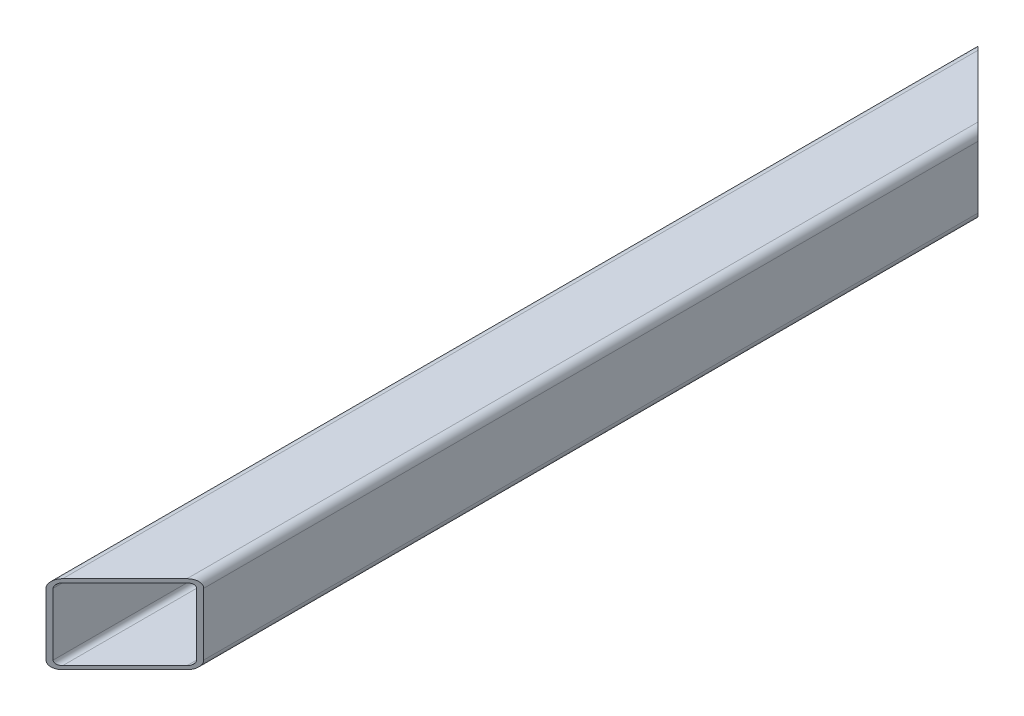
ISO-10303-21;
HEADER;
FILE_DESCRIPTION(('STEP AP214'),'2;1');
FILE_NAME('part.step','',(''),(''),'','','');
FILE_SCHEMA(('AUTOMOTIVE_DESIGN { 1 0 10303 214 1 1 1 1 }'));
ENDSEC;
DATA;
#1=APPLICATION_CONTEXT('core data for automotive mechanical design processes');
#2=APPLICATION_PROTOCOL_DEFINITION('international standard','automotive_design',2000,#1);
#3=PRODUCT_CONTEXT('',#1,'mechanical');
#4=PRODUCT('Part','Part','',(#3));
#5=PRODUCT_RELATED_PRODUCT_CATEGORY('part','',(#4));
#6=PRODUCT_DEFINITION_FORMATION('','',#4);
#7=PRODUCT_DEFINITION_CONTEXT('part definition',#1,'design');
#8=PRODUCT_DEFINITION('design','',#6,#7);
#9=PRODUCT_DEFINITION_SHAPE('','',#8);
#10=(LENGTH_UNIT() NAMED_UNIT(*) SI_UNIT(.MILLI.,.METRE.));
#11=(NAMED_UNIT(*) PLANE_ANGLE_UNIT() SI_UNIT($,.RADIAN.));
#12=(NAMED_UNIT(*) SI_UNIT($,.STERADIAN.) SOLID_ANGLE_UNIT());
#13=UNCERTAINTY_MEASURE_WITH_UNIT(LENGTH_MEASURE(1.E-05),#10,'distance_accuracy_value','');
#14=(GEOMETRIC_REPRESENTATION_CONTEXT(3) GLOBAL_UNCERTAINTY_ASSIGNED_CONTEXT((#13)) GLOBAL_UNIT_ASSIGNED_CONTEXT((#10,
#11,#12)) REPRESENTATION_CONTEXT('',''));
#15=CARTESIAN_POINT('',(0.,0.,0.));
#16=DIRECTION('',(0.,0.,1.));
#17=DIRECTION('',(1.,0.,0.));
#18=AXIS2_PLACEMENT_3D('',#15,#16,#17);
#19=CARTESIAN_POINT('',(28.,2.,390.));
#20=DIRECTION('',(0.,0.,-1.));
#21=DIRECTION('',(-1.,0.,0.));
#22=AXIS2_PLACEMENT_3D('',#19,#20,#21);
#23=CYLINDRICAL_SURFACE('',#22,3.5);
#24=DIRECTION('',(0.,0.,-1.));
#25=VECTOR('',#24,1.);
#26=CARTESIAN_POINT('',(31.5,2.00000000000001,390.));
#27=LINE('',#26,#25);
#28=CARTESIAN_POINT('',(31.5,2.00000000000001,357.));
#29=VERTEX_POINT('',#28);
#30=CARTESIAN_POINT('',(31.5,2.00000000000001,33.));
#31=VERTEX_POINT('',#30);
#32=EDGE_CURVE('E219',#29,#31,#27,.T.);
#33=ORIENTED_EDGE('',*,*,#32,.F.);
#34=CARTESIAN_POINT('',(28.,2.,360.5));
#35=DIRECTION('',(-0.707106781186548,0.,-0.707106781186547));
#36=DIRECTION('',(0.707106781186547,0.,-0.707106781186548));
#37=AXIS2_PLACEMENT_3D('',#34,#35,#36);
#38=ELLIPSE('',#37,4.94974746830584,3.5);
#39=CARTESIAN_POINT('',(28.,-1.5,360.5));
#40=VERTEX_POINT('',#39);
#41=EDGE_CURVE('E201',#29,#40,#38,.T.);
#42=ORIENTED_EDGE('',*,*,#41,.T.);
#43=DIRECTION('',(0.,0.,-1.));
#44=VECTOR('',#43,1.);
#45=CARTESIAN_POINT('',(28.,-1.5,390.));
#46=LINE('',#45,#44);
#47=CARTESIAN_POINT('',(28.,-1.5,29.5000000000001));
#48=VERTEX_POINT('',#47);
#49=EDGE_CURVE('E280',#40,#48,#46,.T.);
#50=ORIENTED_EDGE('',*,*,#49,.T.);
#51=CARTESIAN_POINT('',(28.,2.,29.5));
#52=DIRECTION('',(-0.707106781186547,0.,0.707106781186547));
#53=DIRECTION('',(-0.707106781186548,0.,-0.707106781186548));
#54=AXIS2_PLACEMENT_3D('',#51,#52,#53);
#55=ELLIPSE('',#54,4.94974746830583,3.5);
#56=EDGE_CURVE('E260',#48,#31,#55,.T.);
#57=ORIENTED_EDGE('',*,*,#56,.T.);
#58=EDGE_LOOP('',(#33,#42,#50,#57));
#59=FACE_BOUND('',#58,.T.);
#60=ADVANCED_FACE('F82',(#59),#23,.T.);
#61=CARTESIAN_POINT('',(31.5,2.00000000000001,390.));
#62=DIRECTION('',(-1.,0.,0.));
#63=DIRECTION('',(0.,0.,1.));
#64=AXIS2_PLACEMENT_3D('',#61,#62,#63);
#65=PLANE('',#64);
#66=DIRECTION('',(0.,0.,-1.));
#67=VECTOR('',#66,1.);
#68=CARTESIAN_POINT('',(31.5,28.,390.));
#69=LINE('',#68,#67);
#70=CARTESIAN_POINT('',(31.5,28.,357.));
#71=VERTEX_POINT('',#70);
#72=CARTESIAN_POINT('',(31.5,28.,33.));
#73=VERTEX_POINT('',#72);
#74=EDGE_CURVE('E217',#71,#73,#69,.T.);
#75=ORIENTED_EDGE('',*,*,#74,.F.);
#76=DIRECTION('',(0.,1.,0.));
#77=VECTOR('',#76,1.);
#78=CARTESIAN_POINT('',(31.5,-1.5,357.));
#79=LINE('',#78,#77);
#80=EDGE_CURVE('E197',#29,#71,#79,.T.);
#81=ORIENTED_EDGE('',*,*,#80,.F.);
#82=ORIENTED_EDGE('',*,*,#32,.T.);
#83=DIRECTION('',(0.,1.,0.));
#84=VECTOR('',#83,1.);
#85=CARTESIAN_POINT('',(31.5,-1.5,33.));
#86=LINE('',#85,#84);
#87=EDGE_CURVE('E302',#31,#73,#86,.T.);
#88=ORIENTED_EDGE('',*,*,#87,.T.);
#89=EDGE_LOOP('',(#75,#81,#82,#88));
#90=FACE_BOUND('',#89,.T.);
#91=ADVANCED_FACE('F368',(#90),#65,.F.);
#92=CARTESIAN_POINT('',(28.,28.,390.));
#93=DIRECTION('',(0.,0.,-1.));
#94=DIRECTION('',(-1.,0.,0.));
#95=AXIS2_PLACEMENT_3D('',#92,#93,#94);
#96=CYLINDRICAL_SURFACE('',#95,3.5);
#97=DIRECTION('',(0.,0.,-1.));
#98=VECTOR('',#97,1.);
#99=CARTESIAN_POINT('',(28.,31.5,390.));
#100=LINE('',#99,#98);
#101=CARTESIAN_POINT('',(28.,31.5,360.5));
#102=VERTEX_POINT('',#101);
#103=CARTESIAN_POINT('',(28.,31.5,29.5));
#104=VERTEX_POINT('',#103);
#105=EDGE_CURVE('E208',#102,#104,#100,.T.);
#106=ORIENTED_EDGE('',*,*,#105,.F.);
#107=CARTESIAN_POINT('',(28.,28.,360.5));
#108=DIRECTION('',(-0.707106781186548,0.,-0.707106781186547));
#109=DIRECTION('',(0.707106781186547,0.,-0.707106781186548));
#110=AXIS2_PLACEMENT_3D('',#107,#108,#109);
#111=ELLIPSE('',#110,4.94974746830584,3.5);
#112=EDGE_CURVE('E191',#102,#71,#111,.T.);
#113=ORIENTED_EDGE('',*,*,#112,.T.);
#114=ORIENTED_EDGE('',*,*,#74,.T.);
#115=CARTESIAN_POINT('',(28.,28.,29.5));
#116=DIRECTION('',(-0.707106781186547,0.,0.707106781186547));
#117=DIRECTION('',(-0.707106781186548,0.,-0.707106781186548));
#118=AXIS2_PLACEMENT_3D('',#115,#116,#117);
#119=ELLIPSE('',#118,4.94974746830584,3.5);
#120=EDGE_CURVE('E216',#73,#104,#119,.T.);
#121=ORIENTED_EDGE('',*,*,#120,.T.);
#122=EDGE_LOOP('',(#106,#113,#114,#121));
#123=FACE_BOUND('',#122,.T.);
#124=ADVANCED_FACE('F214',(#123),#96,.T.);
#125=CARTESIAN_POINT('',(2.00000000000001,31.5,390.));
#126=DIRECTION('',(0.,-1.,0.));
#127=DIRECTION('',(0.,0.,-1.));
#128=AXIS2_PLACEMENT_3D('',#125,#126,#127);
#129=PLANE('',#128);
#130=DIRECTION('',(0.,0.,-1.));
#131=VECTOR('',#130,1.);
#132=CARTESIAN_POINT('',(2.00000000000001,31.5,390.));
#133=LINE('',#132,#131);
#134=CARTESIAN_POINT('',(2.,31.5,386.5));
#135=VERTEX_POINT('',#134);
#136=CARTESIAN_POINT('',(1.99999999999998,31.5,3.49999999999996));
#137=VERTEX_POINT('',#136);
#138=EDGE_CURVE('E210',#135,#137,#133,.T.);
#139=ORIENTED_EDGE('',*,*,#138,.F.);
#140=DIRECTION('',(-0.707106781186547,0.,0.707106781186548));
#141=VECTOR('',#140,1.);
#142=CARTESIAN_POINT('',(-1.5,31.5,390.));
#143=LINE('',#142,#141);
#144=EDGE_CURVE('E194',#102,#135,#143,.T.);
#145=ORIENTED_EDGE('',*,*,#144,.F.);
#146=ORIENTED_EDGE('',*,*,#105,.T.);
#147=DIRECTION('',(0.707106781186547,0.,0.707106781186547));
#148=VECTOR('',#147,1.);
#149=CARTESIAN_POINT('',(-1.5,31.5,0.));
#150=LINE('',#149,#148);
#151=EDGE_CURVE('E298',#137,#104,#150,.T.);
#152=ORIENTED_EDGE('',*,*,#151,.F.);
#153=EDGE_LOOP('',(#139,#145,#146,#152));
#154=FACE_BOUND('',#153,.T.);
#155=ADVANCED_FACE('F206',(#154),#129,.F.);
#156=CARTESIAN_POINT('',(2.,28.,390.));
#157=DIRECTION('',(0.,0.,-1.));
#158=DIRECTION('',(-1.,0.,0.));
#159=AXIS2_PLACEMENT_3D('',#156,#157,#158);
#160=CYLINDRICAL_SURFACE('',#159,3.5);
#161=DIRECTION('',(0.,0.,-1.));
#162=VECTOR('',#161,1.);
#163=CARTESIAN_POINT('',(-1.5,28.,390.));
#164=LINE('',#163,#162);
#165=CARTESIAN_POINT('',(-1.5,28.,390.));
#166=VERTEX_POINT('',#165);
#167=CARTESIAN_POINT('',(-1.5,28.,0.));
#168=VERTEX_POINT('',#167);
#169=EDGE_CURVE('E221',#166,#168,#164,.T.);
#170=ORIENTED_EDGE('',*,*,#169,.F.);
#171=CARTESIAN_POINT('',(2.,28.,386.5));
#172=DIRECTION('',(-0.707106781186548,0.,-0.707106781186547));
#173=DIRECTION('',(0.707106781186547,0.,-0.707106781186548));
#174=AXIS2_PLACEMENT_3D('',#171,#172,#173);
#175=ELLIPSE('',#174,4.94974746830584,3.5);
#176=EDGE_CURVE('E202',#166,#135,#175,.T.);
#177=ORIENTED_EDGE('',*,*,#176,.T.);
#178=ORIENTED_EDGE('',*,*,#138,.T.);
#179=CARTESIAN_POINT('',(2.,28.,3.5));
#180=DIRECTION('',(-0.707106781186547,0.,0.707106781186547));
#181=DIRECTION('',(-0.707106781186548,0.,-0.707106781186548));
#182=AXIS2_PLACEMENT_3D('',#179,#180,#181);
#183=ELLIPSE('',#182,4.94974746830583,3.5);
#184=EDGE_CURVE('E251',#137,#168,#183,.T.);
#185=ORIENTED_EDGE('',*,*,#184,.T.);
#186=EDGE_LOOP('',(#170,#177,#178,#185));
#187=FACE_BOUND('',#186,.T.);
#188=ADVANCED_FACE('F295',(#187),#160,.T.);
#189=CARTESIAN_POINT('',(-1.5,2.00000000000001,390.));
#190=DIRECTION('',(1.,0.,0.));
#191=DIRECTION('',(0.,0.,-1.));
#192=AXIS2_PLACEMENT_3D('',#189,#190,#191);
#193=PLANE('',#192);
#194=DIRECTION('',(0.,-1.,0.));
#195=VECTOR('',#194,1.);
#196=CARTESIAN_POINT('',(-1.5,2.00000000000001,0.));
#197=LINE('',#196,#195);
#198=CARTESIAN_POINT('',(-1.5,2.,0.));
#199=VERTEX_POINT('',#198);
#200=EDGE_CURVE('E277',#168,#199,#197,.T.);
#201=ORIENTED_EDGE('',*,*,#200,.T.);
#202=DIRECTION('',(0.,0.,-1.));
#203=VECTOR('',#202,1.);
#204=CARTESIAN_POINT('',(-1.5,2.00000000000001,390.));
#205=LINE('',#204,#203);
#206=CARTESIAN_POINT('',(-1.5,2.,390.));
#207=VERTEX_POINT('',#206);
#208=EDGE_CURVE('E286',#207,#199,#205,.T.);
#209=ORIENTED_EDGE('',*,*,#208,.F.);
#210=DIRECTION('',(0.,-1.,0.));
#211=VECTOR('',#210,1.);
#212=CARTESIAN_POINT('',(-1.5,2.00000000000001,390.));
#213=LINE('',#212,#211);
#214=EDGE_CURVE('E278',#166,#207,#213,.T.);
#215=ORIENTED_EDGE('',*,*,#214,.F.);
#216=ORIENTED_EDGE('',*,*,#169,.T.);
#217=EDGE_LOOP('',(#201,#209,#215,#216));
#218=FACE_BOUND('',#217,.T.);
#219=ADVANCED_FACE('F292',(#218),#193,.F.);
#220=CARTESIAN_POINT('',(2.,2.,390.));
#221=DIRECTION('',(0.,0.,-1.));
#222=DIRECTION('',(-1.,0.,0.));
#223=AXIS2_PLACEMENT_3D('',#220,#221,#222);
#224=CYLINDRICAL_SURFACE('',#223,3.5);
#225=DIRECTION('',(0.,0.,-1.));
#226=VECTOR('',#225,1.);
#227=CARTESIAN_POINT('',(2.00000000000003,-1.5,390.));
#228=LINE('',#227,#226);
#229=CARTESIAN_POINT('',(2.00000000000003,-1.5,386.5));
#230=VERTEX_POINT('',#229);
#231=CARTESIAN_POINT('',(2.00000000000008,-1.5,3.50000000000009));
#232=VERTEX_POINT('',#231);
#233=EDGE_CURVE('E284',#230,#232,#228,.T.);
#234=ORIENTED_EDGE('',*,*,#233,.F.);
#235=CARTESIAN_POINT('',(2.,2.,386.5));
#236=DIRECTION('',(-0.707106781186548,0.,-0.707106781186547));
#237=DIRECTION('',(0.707106781186547,0.,-0.707106781186548));
#238=AXIS2_PLACEMENT_3D('',#235,#236,#237);
#239=ELLIPSE('',#238,4.94974746830584,3.5);
#240=EDGE_CURVE('E96',#230,#207,#239,.T.);
#241=ORIENTED_EDGE('',*,*,#240,.T.);
#242=ORIENTED_EDGE('',*,*,#208,.T.);
#243=CARTESIAN_POINT('',(2.,2.,3.5));
#244=DIRECTION('',(-0.707106781186547,0.,0.707106781186547));
#245=DIRECTION('',(-0.707106781186548,0.,-0.707106781186548));
#246=AXIS2_PLACEMENT_3D('',#243,#244,#245);
#247=ELLIPSE('',#246,4.94974746830583,3.5);
#248=EDGE_CURVE('E247',#199,#232,#247,.T.);
#249=ORIENTED_EDGE('',*,*,#248,.T.);
#250=EDGE_LOOP('',(#234,#241,#242,#249));
#251=FACE_BOUND('',#250,.T.);
#252=ADVANCED_FACE('F359',(#251),#224,.T.);
#253=CARTESIAN_POINT('',(2.00000000000001,-1.5,390.));
#254=DIRECTION('',(0.,1.,0.));
#255=DIRECTION('',(0.,0.,1.));
#256=AXIS2_PLACEMENT_3D('',#253,#254,#255);
#257=PLANE('',#256);
#258=ORIENTED_EDGE('',*,*,#49,.F.);
#259=DIRECTION('',(-0.707106781186547,0.,0.707106781186548));
#260=VECTOR('',#259,1.);
#261=CARTESIAN_POINT('',(-1.5,-1.5,390.));
#262=LINE('',#261,#260);
#263=EDGE_CURVE('E211',#40,#230,#262,.T.);
#264=ORIENTED_EDGE('',*,*,#263,.T.);
#265=ORIENTED_EDGE('',*,*,#233,.T.);
#266=DIRECTION('',(0.707106781186547,0.,0.707106781186547));
#267=VECTOR('',#266,1.);
#268=CARTESIAN_POINT('',(-1.5,-1.5,0.));
#269=LINE('',#268,#267);
#270=EDGE_CURVE('E299',#232,#48,#269,.T.);
#271=ORIENTED_EDGE('',*,*,#270,.T.);
#272=EDGE_LOOP('',(#258,#264,#265,#271));
#273=FACE_BOUND('',#272,.T.);
#274=ADVANCED_FACE('F362',(#273),#257,.F.);
#275=CARTESIAN_POINT('',(28.,2.,390.));
#276=DIRECTION('',(0.,0.,-1.));
#277=DIRECTION('',(-1.,0.,0.));
#278=AXIS2_PLACEMENT_3D('',#275,#276,#277);
#279=CYLINDRICAL_SURFACE('',#278,2.);
#280=CARTESIAN_POINT('',(28.,2.,360.5));
#281=DIRECTION('',(-0.707106781186548,0.,-0.707106781186547));
#282=DIRECTION('',(0.707106781186547,0.,-0.707106781186548));
#283=AXIS2_PLACEMENT_3D('',#280,#281,#282);
#284=ELLIPSE('',#283,2.82842712474619,2.);
#285=CARTESIAN_POINT('',(30.,2.00000000000001,358.5));
#286=VERTEX_POINT('',#285);
#287=CARTESIAN_POINT('',(28.,0.,360.5));
#288=VERTEX_POINT('',#287);
#289=EDGE_CURVE('E103',#286,#288,#284,.T.);
#290=ORIENTED_EDGE('',*,*,#289,.F.);
#291=DIRECTION('',(0.,0.,-1.));
#292=VECTOR('',#291,1.);
#293=CARTESIAN_POINT('',(30.,2.00000000000001,390.));
#294=LINE('',#293,#292);
#295=CARTESIAN_POINT('',(30.,2.00000000000001,31.5));
#296=VERTEX_POINT('',#295);
#297=EDGE_CURVE('E246',#286,#296,#294,.T.);
#298=ORIENTED_EDGE('',*,*,#297,.T.);
#299=CARTESIAN_POINT('',(28.,2.,29.5));
#300=DIRECTION('',(-0.707106781186547,0.,0.707106781186547));
#301=DIRECTION('',(-0.707106781186548,0.,-0.707106781186548));
#302=AXIS2_PLACEMENT_3D('',#299,#300,#301);
#303=ELLIPSE('',#302,2.82842712474619,2.);
#304=CARTESIAN_POINT('',(28.,0.,29.5000000000001));
#305=VERTEX_POINT('',#304);
#306=EDGE_CURVE('E234',#305,#296,#303,.T.);
#307=ORIENTED_EDGE('',*,*,#306,.F.);
#308=DIRECTION('',(0.,0.,-1.));
#309=VECTOR('',#308,1.);
#310=CARTESIAN_POINT('',(28.,0.,390.));
#311=LINE('',#310,#309);
#312=EDGE_CURVE('E244',#288,#305,#311,.T.);
#313=ORIENTED_EDGE('',*,*,#312,.F.);
#314=EDGE_LOOP('',(#290,#298,#307,#313));
#315=FACE_BOUND('',#314,.T.);
#316=ADVANCED_FACE('F243',(#315),#279,.F.);
#317=CARTESIAN_POINT('',(30.,2.00000000000001,390.));
#318=DIRECTION('',(-1.,0.,0.));
#319=DIRECTION('',(0.,0.,1.));
#320=AXIS2_PLACEMENT_3D('',#317,#318,#319);
#321=PLANE('',#320);
#322=DIRECTION('',(0.,-1.,0.));
#323=VECTOR('',#322,1.);
#324=CARTESIAN_POINT('',(30.,2.00000000000001,358.5));
#325=LINE('',#324,#323);
#326=CARTESIAN_POINT('',(30.,28.,358.5));
#327=VERTEX_POINT('',#326);
#328=EDGE_CURVE('E353',#327,#286,#325,.T.);
#329=ORIENTED_EDGE('',*,*,#328,.F.);
#330=DIRECTION('',(0.,0.,-1.));
#331=VECTOR('',#330,1.);
#332=CARTESIAN_POINT('',(30.,28.,390.));
#333=LINE('',#332,#331);
#334=CARTESIAN_POINT('',(30.,28.,31.5));
#335=VERTEX_POINT('',#334);
#336=EDGE_CURVE('E274',#327,#335,#333,.T.);
#337=ORIENTED_EDGE('',*,*,#336,.T.);
#338=DIRECTION('',(0.,1.,0.));
#339=VECTOR('',#338,1.);
#340=CARTESIAN_POINT('',(30.,2.00000000000001,31.5));
#341=LINE('',#340,#339);
#342=EDGE_CURVE('E248',#296,#335,#341,.T.);
#343=ORIENTED_EDGE('',*,*,#342,.F.);
#344=ORIENTED_EDGE('',*,*,#297,.F.);
#345=EDGE_LOOP('',(#329,#337,#343,#344));
#346=FACE_BOUND('',#345,.T.);
#347=ADVANCED_FACE('F388',(#346),#321,.T.);
#348=CARTESIAN_POINT('',(28.,28.,390.));
#349=DIRECTION('',(0.,0.,-1.));
#350=DIRECTION('',(-1.,0.,0.));
#351=AXIS2_PLACEMENT_3D('',#348,#349,#350);
#352=CYLINDRICAL_SURFACE('',#351,2.);
#353=CARTESIAN_POINT('',(28.,28.,360.5));
#354=DIRECTION('',(-0.707106781186548,0.,-0.707106781186547));
#355=DIRECTION('',(0.707106781186547,0.,-0.707106781186548));
#356=AXIS2_PLACEMENT_3D('',#353,#354,#355);
#357=ELLIPSE('',#356,2.82842712474619,2.);
#358=CARTESIAN_POINT('',(28.,30.,360.5));
#359=VERTEX_POINT('',#358);
#360=EDGE_CURVE('E351',#359,#327,#357,.T.);
#361=ORIENTED_EDGE('',*,*,#360,.F.);
#362=DIRECTION('',(0.,0.,-1.));
#363=VECTOR('',#362,1.);
#364=CARTESIAN_POINT('',(28.,30.,390.));
#365=LINE('',#364,#363);
#366=CARTESIAN_POINT('',(28.,30.,29.5000000000001));
#367=VERTEX_POINT('',#366);
#368=EDGE_CURVE('E272',#359,#367,#365,.T.);
#369=ORIENTED_EDGE('',*,*,#368,.T.);
#370=CARTESIAN_POINT('',(28.,28.,29.5));
#371=DIRECTION('',(-0.707106781186547,0.,0.707106781186547));
#372=DIRECTION('',(-0.707106781186548,0.,-0.707106781186548));
#373=AXIS2_PLACEMENT_3D('',#370,#371,#372);
#374=ELLIPSE('',#373,2.82842712474619,2.);
#375=EDGE_CURVE('E253',#335,#367,#374,.T.);
#376=ORIENTED_EDGE('',*,*,#375,.F.);
#377=ORIENTED_EDGE('',*,*,#336,.F.);
#378=EDGE_LOOP('',(#361,#369,#376,#377));
#379=FACE_BOUND('',#378,.T.);
#380=ADVANCED_FACE('F391',(#379),#352,.F.);
#381=CARTESIAN_POINT('',(2.00000000000001,30.,390.));
#382=DIRECTION('',(0.,-1.,0.));
#383=DIRECTION('',(0.,0.,-1.));
#384=AXIS2_PLACEMENT_3D('',#381,#382,#383);
#385=PLANE('',#384);
#386=DIRECTION('',(0.707106781186547,0.,-0.707106781186548));
#387=VECTOR('',#386,1.);
#388=CARTESIAN_POINT('',(0.250000000000005,30.,388.25));
#389=LINE('',#388,#387);
#390=CARTESIAN_POINT('',(2.00000000000001,30.,386.5));
#391=VERTEX_POINT('',#390);
#392=EDGE_CURVE('E328',#391,#359,#389,.T.);
#393=ORIENTED_EDGE('',*,*,#392,.F.);
#394=DIRECTION('',(0.,0.,-1.));
#395=VECTOR('',#394,1.);
#396=CARTESIAN_POINT('',(2.00000000000001,30.,390.));
#397=LINE('',#396,#395);
#398=CARTESIAN_POINT('',(2.00000000000001,30.,3.5));
#399=VERTEX_POINT('',#398);
#400=EDGE_CURVE('E270',#391,#399,#397,.T.);
#401=ORIENTED_EDGE('',*,*,#400,.T.);
#402=DIRECTION('',(-0.707106781186548,0.,-0.707106781186548));
#403=VECTOR('',#402,1.);
#404=CARTESIAN_POINT('',(195.25,30.,196.75));
#405=LINE('',#404,#403);
#406=EDGE_CURVE('E315',#367,#399,#405,.T.);
#407=ORIENTED_EDGE('',*,*,#406,.F.);
#408=ORIENTED_EDGE('',*,*,#368,.F.);
#409=EDGE_LOOP('',(#393,#401,#407,#408));
#410=FACE_BOUND('',#409,.T.);
#411=ADVANCED_FACE('F326',(#410),#385,.T.);
#412=CARTESIAN_POINT('',(2.,28.,390.));
#413=DIRECTION('',(0.,0.,-1.));
#414=DIRECTION('',(-1.,0.,0.));
#415=AXIS2_PLACEMENT_3D('',#412,#413,#414);
#416=CYLINDRICAL_SURFACE('',#415,2.);
#417=CARTESIAN_POINT('',(2.,28.,386.5));
#418=DIRECTION('',(-0.707106781186548,0.,-0.707106781186547));
#419=DIRECTION('',(0.707106781186547,0.,-0.707106781186548));
#420=AXIS2_PLACEMENT_3D('',#417,#418,#419);
#421=ELLIPSE('',#420,2.82842712474619,2.);
#422=CARTESIAN_POINT('',(0.,28.,388.5));
#423=VERTEX_POINT('',#422);
#424=EDGE_CURVE('E332',#423,#391,#421,.T.);
#425=ORIENTED_EDGE('',*,*,#424,.F.);
#426=DIRECTION('',(0.,0.,-1.));
#427=VECTOR('',#426,1.);
#428=CARTESIAN_POINT('',(0.,28.,390.));
#429=LINE('',#428,#427);
#430=CARTESIAN_POINT('',(0.,28.,1.5));
#431=VERTEX_POINT('',#430);
#432=EDGE_CURVE('E268',#423,#431,#429,.T.);
#433=ORIENTED_EDGE('',*,*,#432,.T.);
#434=CARTESIAN_POINT('',(2.,28.,3.5));
#435=DIRECTION('',(-0.707106781186547,0.,0.707106781186547));
#436=DIRECTION('',(-0.707106781186548,0.,-0.707106781186548));
#437=AXIS2_PLACEMENT_3D('',#434,#435,#436);
#438=ELLIPSE('',#437,2.82842712474619,2.);
#439=EDGE_CURVE('E312',#399,#431,#438,.T.);
#440=ORIENTED_EDGE('',*,*,#439,.F.);
#441=ORIENTED_EDGE('',*,*,#400,.F.);
#442=EDGE_LOOP('',(#425,#433,#440,#441));
#443=FACE_BOUND('',#442,.T.);
#444=ADVANCED_FACE('F331',(#443),#416,.F.);
#445=CARTESIAN_POINT('',(0.,2.00000000000001,390.));
#446=DIRECTION('',(1.,0.,0.));
#447=DIRECTION('',(0.,0.,-1.));
#448=AXIS2_PLACEMENT_3D('',#445,#446,#447);
#449=PLANE('',#448);
#450=DIRECTION('',(0.,1.,0.));
#451=VECTOR('',#450,1.);
#452=CARTESIAN_POINT('',(0.,2.00000000000001,388.5));
#453=LINE('',#452,#451);
#454=CARTESIAN_POINT('',(0.,2.00000000000001,388.5));
#455=VERTEX_POINT('',#454);
#456=EDGE_CURVE('E339',#455,#423,#453,.T.);
#457=ORIENTED_EDGE('',*,*,#456,.F.);
#458=DIRECTION('',(0.,0.,-1.));
#459=VECTOR('',#458,1.);
#460=CARTESIAN_POINT('',(0.,2.00000000000001,390.));
#461=LINE('',#460,#459);
#462=CARTESIAN_POINT('',(0.,2.00000000000001,1.5));
#463=VERTEX_POINT('',#462);
#464=EDGE_CURVE('E266',#455,#463,#461,.T.);
#465=ORIENTED_EDGE('',*,*,#464,.T.);
#466=DIRECTION('',(0.,-1.,0.));
#467=VECTOR('',#466,1.);
#468=CARTESIAN_POINT('',(0.,2.00000000000001,1.5));
#469=LINE('',#468,#467);
#470=EDGE_CURVE('E310',#431,#463,#469,.T.);
#471=ORIENTED_EDGE('',*,*,#470,.F.);
#472=ORIENTED_EDGE('',*,*,#432,.F.);
#473=EDGE_LOOP('',(#457,#465,#471,#472));
#474=FACE_BOUND('',#473,.T.);
#475=ADVANCED_FACE('F337',(#474),#449,.T.);
#476=CARTESIAN_POINT('',(2.,2.,390.));
#477=DIRECTION('',(0.,0.,-1.));
#478=DIRECTION('',(-1.,0.,0.));
#479=AXIS2_PLACEMENT_3D('',#476,#477,#478);
#480=CYLINDRICAL_SURFACE('',#479,2.);
#481=CARTESIAN_POINT('',(2.,2.,386.5));
#482=DIRECTION('',(-0.707106781186548,0.,-0.707106781186547));
#483=DIRECTION('',(0.707106781186547,0.,-0.707106781186548));
#484=AXIS2_PLACEMENT_3D('',#481,#482,#483);
#485=ELLIPSE('',#484,2.82842712474619,2.);
#486=CARTESIAN_POINT('',(2.00000000000001,0.,386.5));
#487=VERTEX_POINT('',#486);
#488=EDGE_CURVE('E343',#487,#455,#485,.T.);
#489=ORIENTED_EDGE('',*,*,#488,.F.);
#490=DIRECTION('',(0.,0.,-1.));
#491=VECTOR('',#490,1.);
#492=CARTESIAN_POINT('',(2.00000000000001,0.,390.));
#493=LINE('',#492,#491);
#494=CARTESIAN_POINT('',(2.00000000000004,0.,3.50000000000014));
#495=VERTEX_POINT('',#494);
#496=EDGE_CURVE('E264',#487,#495,#493,.T.);
#497=ORIENTED_EDGE('',*,*,#496,.T.);
#498=CARTESIAN_POINT('',(2.,2.,3.5));
#499=DIRECTION('',(-0.707106781186547,0.,0.707106781186547));
#500=DIRECTION('',(-0.707106781186548,0.,-0.707106781186548));
#501=AXIS2_PLACEMENT_3D('',#498,#499,#500);
#502=ELLIPSE('',#501,2.82842712474619,2.);
#503=EDGE_CURVE('E238',#463,#495,#502,.T.);
#504=ORIENTED_EDGE('',*,*,#503,.F.);
#505=ORIENTED_EDGE('',*,*,#464,.F.);
#506=EDGE_LOOP('',(#489,#497,#504,#505));
#507=FACE_BOUND('',#506,.T.);
#508=ADVANCED_FACE('F342',(#507),#480,.F.);
#509=CARTESIAN_POINT('',(2.00000000000001,0.,390.));
#510=DIRECTION('',(0.,1.,0.));
#511=DIRECTION('',(0.,0.,1.));
#512=AXIS2_PLACEMENT_3D('',#509,#510,#511);
#513=PLANE('',#512);
#514=DIRECTION('',(-0.707106781186547,0.,0.707106781186548));
#515=VECTOR('',#514,1.);
#516=CARTESIAN_POINT('',(0.250000000000005,0.,388.25));
#517=LINE('',#516,#515);
#518=EDGE_CURVE('E12',#288,#487,#517,.T.);
#519=ORIENTED_EDGE('',*,*,#518,.F.);
#520=ORIENTED_EDGE('',*,*,#312,.T.);
#521=DIRECTION('',(0.707106781186548,0.,0.707106781186548));
#522=VECTOR('',#521,1.);
#523=CARTESIAN_POINT('',(195.25,0.,196.75));
#524=LINE('',#523,#522);
#525=EDGE_CURVE('E89',#495,#305,#524,.T.);
#526=ORIENTED_EDGE('',*,*,#525,.F.);
#527=ORIENTED_EDGE('',*,*,#496,.F.);
#528=EDGE_LOOP('',(#519,#520,#526,#527));
#529=FACE_BOUND('',#528,.T.);
#530=ADVANCED_FACE('F344',(#529),#513,.T.);
#531=CARTESIAN_POINT('',(-1.5,-1.5,0.));
#532=DIRECTION('',(-0.707106781186547,0.,0.707106781186547));
#533=DIRECTION('',(0.707106781186548,0.,0.707106781186548));
#534=AXIS2_PLACEMENT_3D('',#531,#532,#533);
#535=PLANE('',#534);
#536=ORIENTED_EDGE('',*,*,#306,.T.);
#537=ORIENTED_EDGE('',*,*,#342,.T.);
#538=ORIENTED_EDGE('',*,*,#375,.T.);
#539=ORIENTED_EDGE('',*,*,#406,.T.);
#540=ORIENTED_EDGE('',*,*,#439,.T.);
#541=ORIENTED_EDGE('',*,*,#470,.T.);
#542=ORIENTED_EDGE('',*,*,#503,.T.);
#543=ORIENTED_EDGE('',*,*,#525,.T.);
#544=EDGE_LOOP('',(#536,#537,#538,#539,#540,#541,#542,#543));
#545=FACE_BOUND('',#544,.T.);
#546=ORIENTED_EDGE('',*,*,#270,.F.);
#547=ORIENTED_EDGE('',*,*,#248,.F.);
#548=ORIENTED_EDGE('',*,*,#200,.F.);
#549=ORIENTED_EDGE('',*,*,#184,.F.);
#550=ORIENTED_EDGE('',*,*,#151,.T.);
#551=ORIENTED_EDGE('',*,*,#120,.F.);
#552=ORIENTED_EDGE('',*,*,#87,.F.);
#553=ORIENTED_EDGE('',*,*,#56,.F.);
#554=EDGE_LOOP('',(#546,#547,#548,#549,#550,#551,#552,#553));
#555=FACE_BOUND('',#554,.T.);
#556=ADVANCED_FACE('F231',(#545,#555),#535,.F.);
#557=CARTESIAN_POINT('',(-1.5,-1.5,390.));
#558=DIRECTION('',(-0.707106781186548,0.,-0.707106781186547));
#559=DIRECTION('',(-0.707106781186547,0.,0.707106781186548));
#560=AXIS2_PLACEMENT_3D('',#557,#558,#559);
#561=PLANE('',#560);
#562=ORIENTED_EDGE('',*,*,#289,.T.);
#563=ORIENTED_EDGE('',*,*,#518,.T.);
#564=ORIENTED_EDGE('',*,*,#488,.T.);
#565=ORIENTED_EDGE('',*,*,#456,.T.);
#566=ORIENTED_EDGE('',*,*,#424,.T.);
#567=ORIENTED_EDGE('',*,*,#392,.T.);
#568=ORIENTED_EDGE('',*,*,#360,.T.);
#569=ORIENTED_EDGE('',*,*,#328,.T.);
#570=EDGE_LOOP('',(#562,#563,#564,#565,#566,#567,#568,#569));
#571=FACE_BOUND('',#570,.T.);
#572=ORIENTED_EDGE('',*,*,#80,.T.);
#573=ORIENTED_EDGE('',*,*,#112,.F.);
#574=ORIENTED_EDGE('',*,*,#144,.T.);
#575=ORIENTED_EDGE('',*,*,#176,.F.);
#576=ORIENTED_EDGE('',*,*,#214,.T.);
#577=ORIENTED_EDGE('',*,*,#240,.F.);
#578=ORIENTED_EDGE('',*,*,#263,.F.);
#579=ORIENTED_EDGE('',*,*,#41,.F.);
#580=EDGE_LOOP('',(#572,#573,#574,#575,#576,#577,#578,#579));
#581=FACE_BOUND('',#580,.T.);
#582=ADVANCED_FACE('F193',(#571,#581),#561,.F.);
#583=CLOSED_SHELL('',(#60,#91,#124,#155,#188,#219,#252,#274,#316,#347,#380,#411,#444,#475,#508,
#530,#556,#582));
#584=MANIFOLD_SOLID_BREP('B2',#583);
#585=ADVANCED_BREP_SHAPE_REPRESENTATION('',(#18,#584),#14);
#586=SHAPE_DEFINITION_REPRESENTATION(#9,#585);
ENDSEC;
END-ISO-10303-21;
